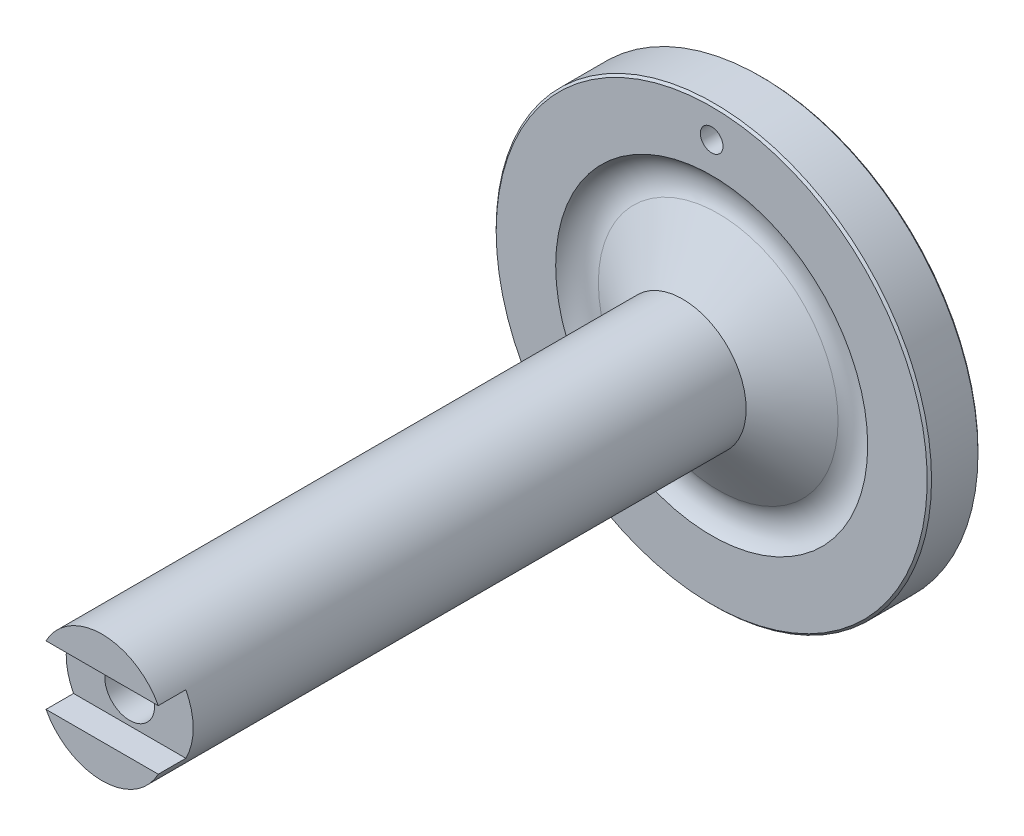
ISO-10303-21;
HEADER;
FILE_DESCRIPTION(('STEP AP214'),'2;1');
FILE_NAME('part.step','',(''),(''),'','','');
FILE_SCHEMA(('AUTOMOTIVE_DESIGN { 1 0 10303 214 1 1 1 1 }'));
ENDSEC;
DATA;
#1=APPLICATION_CONTEXT('core data for automotive mechanical design processes');
#2=APPLICATION_PROTOCOL_DEFINITION('international standard','automotive_design',2000,#1);
#3=PRODUCT_CONTEXT('',#1,'mechanical');
#4=PRODUCT('Part','Part','',(#3));
#5=PRODUCT_RELATED_PRODUCT_CATEGORY('part','',(#4));
#6=PRODUCT_DEFINITION_FORMATION('','',#4);
#7=PRODUCT_DEFINITION_CONTEXT('part definition',#1,'design');
#8=PRODUCT_DEFINITION('design','',#6,#7);
#9=PRODUCT_DEFINITION_SHAPE('','',#8);
#10=(LENGTH_UNIT() NAMED_UNIT(*) SI_UNIT(.MILLI.,.METRE.));
#11=(NAMED_UNIT(*) PLANE_ANGLE_UNIT() SI_UNIT($,.RADIAN.));
#12=(NAMED_UNIT(*) SI_UNIT($,.STERADIAN.) SOLID_ANGLE_UNIT());
#13=UNCERTAINTY_MEASURE_WITH_UNIT(LENGTH_MEASURE(1.E-05),#10,'distance_accuracy_value','');
#14=(GEOMETRIC_REPRESENTATION_CONTEXT(3) GLOBAL_UNCERTAINTY_ASSIGNED_CONTEXT((#13)) GLOBAL_UNIT_ASSIGNED_CONTEXT((#10,
#11,#12)) REPRESENTATION_CONTEXT('',''));
#15=CARTESIAN_POINT('',(0.,0.,0.));
#16=DIRECTION('',(0.,0.,1.));
#17=DIRECTION('',(1.,0.,0.));
#18=AXIS2_PLACEMENT_3D('',#15,#16,#17);
#19=CARTESIAN_POINT('',(0.,8.7376,0.));
#20=DIRECTION('',(0.,0.,-1.));
#21=DIRECTION('',(-1.,0.,0.));
#22=AXIS2_PLACEMENT_3D('',#19,#20,#21);
#23=PLANE('',#22);
#24=CARTESIAN_POINT('',(0.,0.,0.));
#25=DIRECTION('',(0.,0.,1.));
#26=DIRECTION('',(1.,0.,0.));
#27=AXIS2_PLACEMENT_3D('',#24,#25,#26);
#28=CIRCLE('',#27,22.225);
#29=CARTESIAN_POINT('',(19.6475854760833,10.3886,0.));
#30=VERTEX_POINT('',#29);
#31=CARTESIAN_POINT('',(-19.6475854760833,10.3886,0.));
#32=VERTEX_POINT('',#31);
#33=EDGE_CURVE('E161',#30,#32,#28,.T.);
#34=ORIENTED_EDGE('',*,*,#33,.T.);
#35=DIRECTION('',(1.,0.,0.));
#36=VECTOR('',#35,1.);
#37=CARTESIAN_POINT('',(-76.2,10.3886,0.));
#38=LINE('',#37,#36);
#39=EDGE_CURVE('E91',#32,#30,#38,.T.);
#40=ORIENTED_EDGE('',*,*,#39,.T.);
#41=EDGE_LOOP('',(#34,#40));
#42=FACE_BOUND('',#41,.T.);
#43=ADVANCED_FACE('F43',(#42),#23,.F.);
#44=CARTESIAN_POINT('',(0.,0.,0.));
#45=DIRECTION('',(0.,0.,1.));
#46=DIRECTION('',(1.,0.,0.));
#47=AXIS2_PLACEMENT_3D('',#44,#45,#46);
#48=CYLINDRICAL_SURFACE('',#47,22.225);
#49=ORIENTED_EDGE('',*,*,#33,.F.);
#50=DIRECTION('',(0.,0.,1.));
#51=VECTOR('',#50,1.);
#52=CARTESIAN_POINT('',(19.6475854760833,10.3886,0.));
#53=LINE('',#52,#51);
#54=CARTESIAN_POINT('',(19.6475854760833,10.3886,-9.652));
#55=VERTEX_POINT('',#54);
#56=EDGE_CURVE('E69',#30,#55,#53,.F.);
#57=ORIENTED_EDGE('',*,*,#56,.T.);
#58=CARTESIAN_POINT('',(0.,0.,-9.652));
#59=DIRECTION('',(0.,0.,-1.));
#60=DIRECTION('',(0.,1.,0.));
#61=AXIS2_PLACEMENT_3D('',#58,#59,#60);
#62=CIRCLE('',#61,22.225);
#63=CARTESIAN_POINT('',(19.6475854760833,-10.3886,-9.652));
#64=VERTEX_POINT('',#63);
#65=EDGE_CURVE('E104',#55,#64,#62,.T.);
#66=ORIENTED_EDGE('',*,*,#65,.T.);
#67=DIRECTION('',(0.,0.,1.));
#68=VECTOR('',#67,1.);
#69=CARTESIAN_POINT('',(19.6475854760833,-10.3886,0.));
#70=LINE('',#69,#68);
#71=CARTESIAN_POINT('',(19.6475854760833,-10.3886,0.));
#72=VERTEX_POINT('',#71);
#73=EDGE_CURVE('E123',#64,#72,#70,.T.);
#74=ORIENTED_EDGE('',*,*,#73,.T.);
#75=CARTESIAN_POINT('',(-19.6475854760833,-10.3886,0.));
#76=VERTEX_POINT('',#75);
#77=EDGE_CURVE('E160',#76,#72,#28,.T.);
#78=ORIENTED_EDGE('',*,*,#77,.F.);
#79=DIRECTION('',(0.,0.,1.));
#80=VECTOR('',#79,1.);
#81=CARTESIAN_POINT('',(-19.6475854760833,-10.3886,0.));
#82=LINE('',#81,#80);
#83=CARTESIAN_POINT('',(-19.6475854760833,-10.3886,-9.652));
#84=VERTEX_POINT('',#83);
#85=EDGE_CURVE('E61',#76,#84,#82,.F.);
#86=ORIENTED_EDGE('',*,*,#85,.T.);
#87=CARTESIAN_POINT('',(-19.6475854760833,10.3886,-9.652));
#88=VERTEX_POINT('',#87);
#89=EDGE_CURVE('E102',#84,#88,#62,.T.);
#90=ORIENTED_EDGE('',*,*,#89,.T.);
#91=DIRECTION('',(0.,0.,1.));
#92=VECTOR('',#91,1.);
#93=CARTESIAN_POINT('',(-19.6475854760833,10.3886,0.));
#94=LINE('',#93,#92);
#95=EDGE_CURVE('E87',#88,#32,#94,.T.);
#96=ORIENTED_EDGE('',*,*,#95,.T.);
#97=EDGE_LOOP('',(#49,#57,#66,#74,#78,#86,#90,#96));
#98=FACE_BOUND('',#97,.T.);
#99=CARTESIAN_POINT('',(0.,0.,-203.2));
#100=DIRECTION('',(0.,0.,1.));
#101=DIRECTION('',(1.,0.,0.));
#102=AXIS2_PLACEMENT_3D('',#99,#100,#101);
#103=CIRCLE('',#102,22.225);
#104=CARTESIAN_POINT('',(22.225,0.,-203.2));
#105=VERTEX_POINT('',#104);
#106=EDGE_CURVE('E97',#105,#105,#103,.T.);
#107=ORIENTED_EDGE('',*,*,#106,.T.);
#108=EDGE_LOOP('',(#107));
#109=FACE_BOUND('',#108,.T.);
#110=ADVANCED_FACE('F108',(#98,#109),#48,.T.);
#111=ORIENTED_EDGE('',*,*,#77,.T.);
#112=DIRECTION('',(1.,0.,0.));
#113=VECTOR('',#112,1.);
#114=CARTESIAN_POINT('',(-76.2,-10.3886,0.));
#115=LINE('',#114,#113);
#116=EDGE_CURVE('E119',#76,#72,#115,.T.);
#117=ORIENTED_EDGE('',*,*,#116,.F.);
#118=EDGE_LOOP('',(#111,#117));
#119=FACE_BOUND('',#118,.T.);
#120=ADVANCED_FACE('F215',(#119),#23,.F.);
#121=CARTESIAN_POINT('',(0.,0.,0.));
#122=DIRECTION('',(0.,0.,1.));
#123=DIRECTION('',(1.,0.,0.));
#124=AXIS2_PLACEMENT_3D('',#121,#122,#123);
#125=CYLINDRICAL_SURFACE('',#124,8.7376);
#126=CARTESIAN_POINT('',(0.,0.,-9.652));
#127=DIRECTION('',(0.,0.,-1.));
#128=DIRECTION('',(0.,1.,0.));
#129=AXIS2_PLACEMENT_3D('',#126,#127,#128);
#130=CIRCLE('',#129,8.7376);
#131=CARTESIAN_POINT('',(0.,8.7376,-9.652));
#132=VERTEX_POINT('',#131);
#133=EDGE_CURVE('E112',#132,#132,#130,.F.);
#134=ORIENTED_EDGE('',*,*,#133,.T.);
#135=EDGE_LOOP('',(#134));
#136=FACE_BOUND('',#135,.T.);
#137=CARTESIAN_POINT('',(0.,0.,-223.2152));
#138=DIRECTION('',(0.,0.,1.));
#139=DIRECTION('',(1.,0.,0.));
#140=AXIS2_PLACEMENT_3D('',#137,#138,#139);
#141=CIRCLE('',#140,8.7376);
#142=CARTESIAN_POINT('',(8.7376,0.,-223.2152));
#143=VERTEX_POINT('',#142);
#144=EDGE_CURVE('E156',#143,#143,#141,.T.);
#145=ORIENTED_EDGE('',*,*,#144,.F.);
#146=EDGE_LOOP('',(#145));
#147=FACE_BOUND('',#146,.T.);
#148=ADVANCED_FACE('F222',(#136,#147),#125,.F.);
#149=CARTESIAN_POINT('',(0.,15.875,-223.2152));
#150=DIRECTION('',(0.,0.,1.));
#151=DIRECTION('',(1.,0.,0.));
#152=AXIS2_PLACEMENT_3D('',#149,#150,#151);
#153=PLANE('',#152);
#154=CARTESIAN_POINT('',(0.,0.,-223.2152));
#155=DIRECTION('',(0.,0.,1.));
#156=DIRECTION('',(1.,0.,0.));
#157=AXIS2_PLACEMENT_3D('',#154,#155,#156);
#158=CIRCLE('',#157,15.875);
#159=CARTESIAN_POINT('',(15.875,0.,-223.2152));
#160=VERTEX_POINT('',#159);
#161=EDGE_CURVE('E152',#160,#160,#158,.T.);
#162=ORIENTED_EDGE('',*,*,#161,.F.);
#163=EDGE_LOOP('',(#162));
#164=FACE_BOUND('',#163,.T.);
#165=ORIENTED_EDGE('',*,*,#144,.T.);
#166=EDGE_LOOP('',(#165));
#167=FACE_BOUND('',#166,.T.);
#168=ADVANCED_FACE('F227',(#164,#167),#153,.F.);
#169=CARTESIAN_POINT('',(0.,0.,-223.2152));
#170=DIRECTION('',(0.,0.,1.));
#171=DIRECTION('',(1.,0.,0.));
#172=AXIS2_PLACEMENT_3D('',#169,#170,#171);
#173=CONICAL_SURFACE('',#172,15.875,0.785398163397456);
#174=CARTESIAN_POINT('',(0.,0.,-218.471224769071));
#175=DIRECTION('',(0.,0.,1.));
#176=DIRECTION('',(1.,0.,0.));
#177=AXIS2_PLACEMENT_3D('',#174,#175,#176);
#178=CIRCLE('',#177,20.6189752309289);
#179=CARTESIAN_POINT('',(20.6189752309289,0.,-218.471224769071));
#180=VERTEX_POINT('',#179);
#181=EDGE_CURVE('E148',#180,#180,#178,.T.);
#182=ORIENTED_EDGE('',*,*,#181,.F.);
#183=EDGE_LOOP('',(#182));
#184=FACE_BOUND('',#183,.T.);
#185=ORIENTED_EDGE('',*,*,#161,.T.);
#186=EDGE_LOOP('',(#185));
#187=FACE_BOUND('',#186,.T.);
#188=ADVANCED_FACE('F376',(#184,#187),#173,.T.);
#189=CARTESIAN_POINT('',(0.,0.,-225.206416859873));
#190=DIRECTION('',(0.,0.,1.));
#191=DIRECTION('',(1.,0.,0.));
#192=AXIS2_PLACEMENT_3D('',#189,#190,#191);
#193=TOROIDAL_SURFACE('',#192,27.3541673217308,9.52500000000001);
#194=CARTESIAN_POINT('',(0.,0.,-217.150682631207));
#195=DIRECTION('',(0.,0.,1.));
#196=DIRECTION('',(1.,0.,0.));
#197=AXIS2_PLACEMENT_3D('',#194,#195,#196);
#198=CIRCLE('',#197,32.4365654797955);
#199=CARTESIAN_POINT('',(32.4365654797955,0.,-217.150682631207));
#200=VERTEX_POINT('',#199);
#201=EDGE_CURVE('E144',#200,#200,#198,.T.);
#202=ORIENTED_EDGE('',*,*,#201,.F.);
#203=EDGE_LOOP('',(#202));
#204=FACE_BOUND('',#203,.T.);
#205=ORIENTED_EDGE('',*,*,#181,.T.);
#206=EDGE_LOOP('',(#205));
#207=FACE_BOUND('',#206,.T.);
#208=ADVANCED_FACE('F385',(#204,#207),#193,.F.);
#209=CARTESIAN_POINT('',(0.,0.,-217.150682631207));
#210=DIRECTION('',(0.,0.,-1.));
#211=DIRECTION('',(-1.,0.,0.));
#212=AXIS2_PLACEMENT_3D('',#209,#210,#211);
#213=CONICAL_SURFACE('',#212,32.4365654797955,1.00796241442012);
#214=CARTESIAN_POINT('',(0.,0.,-231.14));
#215=DIRECTION('',(0.,0.,1.));
#216=DIRECTION('',(1.,0.,0.));
#217=AXIS2_PLACEMENT_3D('',#214,#215,#216);
#218=CIRCLE('',#217,54.61);
#219=CARTESIAN_POINT('',(54.61,0.,-231.14));
#220=VERTEX_POINT('',#219);
#221=EDGE_CURVE('E140',#220,#220,#218,.T.);
#222=ORIENTED_EDGE('',*,*,#221,.F.);
#223=EDGE_LOOP('',(#222));
#224=FACE_BOUND('',#223,.T.);
#225=ORIENTED_EDGE('',*,*,#201,.T.);
#226=EDGE_LOOP('',(#225));
#227=FACE_BOUND('',#226,.T.);
#228=ADVANCED_FACE('F291',(#224,#227),#213,.F.);
#229=CARTESIAN_POINT('',(0.,76.2,-231.14));
#230=DIRECTION('',(0.,0.,1.));
#231=DIRECTION('',(1.,0.,0.));
#232=AXIS2_PLACEMENT_3D('',#229,#230,#231);
#233=PLANE('',#232);
#234=CARTESIAN_POINT('',(0.,65.405,-231.14));
#235=DIRECTION('',(0.,0.,-1.));
#236=DIRECTION('',(-1.,0.,0.));
#237=AXIS2_PLACEMENT_3D('',#234,#235,#236);
#238=CIRCLE('',#237,3.9624);
#239=CARTESIAN_POINT('',(-3.9624,65.405,-231.14));
#240=VERTEX_POINT('',#239);
#241=EDGE_CURVE('E237',#240,#240,#238,.T.);
#242=ORIENTED_EDGE('',*,*,#241,.F.);
#243=EDGE_LOOP('',(#242));
#244=FACE_BOUND('',#243,.T.);
#245=CARTESIAN_POINT('',(0.,0.,-231.14));
#246=DIRECTION('',(0.,0.,1.));
#247=DIRECTION('',(1.,0.,0.));
#248=AXIS2_PLACEMENT_3D('',#245,#246,#247);
#249=CIRCLE('',#248,75.438);
#250=CARTESIAN_POINT('',(75.438,0.,-231.14));
#251=VERTEX_POINT('',#250);
#252=EDGE_CURVE('E53',#251,#251,#249,.F.);
#253=ORIENTED_EDGE('',*,*,#252,.T.);
#254=EDGE_LOOP('',(#253));
#255=FACE_BOUND('',#254,.T.);
#256=ORIENTED_EDGE('',*,*,#221,.T.);
#257=EDGE_LOOP('',(#256));
#258=FACE_BOUND('',#257,.T.);
#259=ADVANCED_FACE('F176',(#244,#255,#258),#233,.F.);
#260=CARTESIAN_POINT('',(0.,0.,0.));
#261=DIRECTION('',(0.,0.,1.));
#262=DIRECTION('',(1.,0.,0.));
#263=AXIS2_PLACEMENT_3D('',#260,#261,#262);
#264=CYLINDRICAL_SURFACE('',#263,76.2);
#265=CARTESIAN_POINT('',(0.,0.,-230.378));
#266=DIRECTION('',(0.,0.,1.));
#267=DIRECTION('',(1.,0.,0.));
#268=AXIS2_PLACEMENT_3D('',#265,#266,#267);
#269=CIRCLE('',#268,76.2);
#270=CARTESIAN_POINT('',(76.2,0.,-230.378));
#271=VERTEX_POINT('',#270);
#272=EDGE_CURVE('E168',#271,#271,#269,.T.);
#273=ORIENTED_EDGE('',*,*,#272,.T.);
#274=EDGE_LOOP('',(#273));
#275=FACE_BOUND('',#274,.T.);
#276=CARTESIAN_POINT('',(0.,0.,-214.122));
#277=DIRECTION('',(0.,0.,-1.));
#278=DIRECTION('',(-1.,0.,0.));
#279=AXIS2_PLACEMENT_3D('',#276,#277,#278);
#280=CIRCLE('',#279,76.2);
#281=CARTESIAN_POINT('',(-76.2,0.,-214.122));
#282=VERTEX_POINT('',#281);
#283=EDGE_CURVE('E164',#282,#282,#280,.T.);
#284=ORIENTED_EDGE('',*,*,#283,.T.);
#285=EDGE_LOOP('',(#284));
#286=FACE_BOUND('',#285,.T.);
#287=ADVANCED_FACE('F185',(#275,#286),#264,.T.);
#288=CARTESIAN_POINT('',(0.,54.61,-213.36));
#289=DIRECTION('',(0.,0.,-1.));
#290=DIRECTION('',(-1.,0.,0.));
#291=AXIS2_PLACEMENT_3D('',#288,#289,#290);
#292=PLANE('',#291);
#293=CARTESIAN_POINT('',(0.,65.405,-213.36));
#294=DIRECTION('',(0.,0.,-1.));
#295=DIRECTION('',(-1.,0.,0.));
#296=AXIS2_PLACEMENT_3D('',#293,#294,#295);
#297=CIRCLE('',#296,3.9624);
#298=CARTESIAN_POINT('',(-3.9624,65.405,-213.36));
#299=VERTEX_POINT('',#298);
#300=EDGE_CURVE('E47',#299,#299,#297,.T.);
#301=ORIENTED_EDGE('',*,*,#300,.T.);
#302=EDGE_LOOP('',(#301));
#303=FACE_BOUND('',#302,.T.);
#304=CARTESIAN_POINT('',(0.,0.,-213.36));
#305=DIRECTION('',(0.,0.,-1.));
#306=DIRECTION('',(-1.,0.,0.));
#307=AXIS2_PLACEMENT_3D('',#304,#305,#306);
#308=CIRCLE('',#307,75.438);
#309=CARTESIAN_POINT('',(-75.438,0.,-213.36));
#310=VERTEX_POINT('',#309);
#311=EDGE_CURVE('E11',#310,#310,#308,.F.);
#312=ORIENTED_EDGE('',*,*,#311,.T.);
#313=EDGE_LOOP('',(#312));
#314=FACE_BOUND('',#313,.T.);
#315=CARTESIAN_POINT('',(0.,0.,-213.36));
#316=DIRECTION('',(0.,0.,1.));
#317=DIRECTION('',(1.,0.,0.));
#318=AXIS2_PLACEMENT_3D('',#315,#316,#317);
#319=CIRCLE('',#318,54.61);
#320=CARTESIAN_POINT('',(54.61,0.,-213.36));
#321=VERTEX_POINT('',#320);
#322=EDGE_CURVE('E136',#321,#321,#319,.T.);
#323=ORIENTED_EDGE('',*,*,#322,.F.);
#324=EDGE_LOOP('',(#323));
#325=FACE_BOUND('',#324,.T.);
#326=ADVANCED_FACE('F188',(#303,#314,#325),#292,.F.);
#327=CARTESIAN_POINT('',(0.,0.,-207.588870185502));
#328=DIRECTION('',(0.,0.,1.));
#329=DIRECTION('',(1.,0.,0.));
#330=AXIS2_PLACEMENT_3D('',#327,#328,#329);
#331=TOROIDAL_SURFACE('',#330,47.032422176961,9.52500000000004);
#332=CARTESIAN_POINT('',(0.,0.,-215.644604414168));
#333=DIRECTION('',(0.,0.,1.));
#334=DIRECTION('',(1.,0.,0.));
#335=AXIS2_PLACEMENT_3D('',#332,#333,#334);
#336=CIRCLE('',#335,41.9500240188962);
#337=CARTESIAN_POINT('',(41.9500240188962,0.,-215.644604414168));
#338=VERTEX_POINT('',#337);
#339=EDGE_CURVE('E132',#338,#338,#336,.T.);
#340=ORIENTED_EDGE('',*,*,#339,.F.);
#341=EDGE_LOOP('',(#340));
#342=FACE_BOUND('',#341,.T.);
#343=ORIENTED_EDGE('',*,*,#322,.T.);
#344=EDGE_LOOP('',(#343));
#345=FACE_BOUND('',#344,.T.);
#346=ADVANCED_FACE('F198',(#342,#345),#331,.F.);
#347=CARTESIAN_POINT('',(0.,0.,-215.644604414168));
#348=DIRECTION('',(0.,0.,-1.));
#349=DIRECTION('',(-1.,0.,0.));
#350=AXIS2_PLACEMENT_3D('',#347,#348,#349);
#351=CONICAL_SURFACE('',#350,41.9500240188962,1.00796241442012);
#352=ORIENTED_EDGE('',*,*,#106,.F.);
#353=EDGE_LOOP('',(#352));
#354=FACE_BOUND('',#353,.T.);
#355=ORIENTED_EDGE('',*,*,#339,.T.);
#356=EDGE_LOOP('',(#355));
#357=FACE_BOUND('',#356,.T.);
#358=ADVANCED_FACE('F182',(#354,#357),#351,.T.);
#359=CARTESIAN_POINT('',(0.,0.,-230.378));
#360=DIRECTION('',(0.,0.,1.));
#361=DIRECTION('',(1.,0.,0.));
#362=AXIS2_PLACEMENT_3D('',#359,#360,#361);
#363=CONICAL_SURFACE('',#362,76.2,0.785398163397448);
#364=CARTESIAN_POINT('',(75.438,0.,-231.14));
#365=CARTESIAN_POINT('',(75.4459375,0.,-231.1320625));
#366=CARTESIAN_POINT('',(75.453875,0.,-231.124125));
#367=CARTESIAN_POINT('',(75.46975,0.,-231.10825));
#368=CARTESIAN_POINT('',(75.4776875,0.,-231.1003125));
#369=CARTESIAN_POINT('',(75.4935625,0.,-231.0844375));
#370=CARTESIAN_POINT('',(75.5015,0.,-231.0765));
#371=CARTESIAN_POINT('',(75.517375,0.,-231.060625));
#372=CARTESIAN_POINT('',(75.5253125,0.,-231.0526875));
#373=CARTESIAN_POINT('',(75.5411875,0.,-231.0368125));
#374=CARTESIAN_POINT('',(75.549125,0.,-231.028875));
#375=CARTESIAN_POINT('',(75.565,0.,-231.013));
#376=CARTESIAN_POINT('',(75.5729375,0.,-231.0050625));
#377=CARTESIAN_POINT('',(75.5888125,0.,-230.9891875));
#378=CARTESIAN_POINT('',(75.59675,0.,-230.98125));
#379=CARTESIAN_POINT('',(75.612625,0.,-230.965375));
#380=CARTESIAN_POINT('',(75.6205625,0.,-230.9574375));
#381=CARTESIAN_POINT('',(75.6364375,0.,-230.9415625));
#382=CARTESIAN_POINT('',(75.644375,0.,-230.933625));
#383=CARTESIAN_POINT('',(75.66025,0.,-230.91775));
#384=CARTESIAN_POINT('',(75.6681875,0.,-230.9098125));
#385=CARTESIAN_POINT('',(75.6840625,0.,-230.8939375));
#386=CARTESIAN_POINT('',(75.692,0.,-230.886));
#387=CARTESIAN_POINT('',(75.707875,0.,-230.870125));
#388=CARTESIAN_POINT('',(75.7158125,0.,-230.8621875));
#389=CARTESIAN_POINT('',(75.7316875,0.,-230.8463125));
#390=CARTESIAN_POINT('',(75.739625,0.,-230.838375));
#391=CARTESIAN_POINT('',(75.7555,0.,-230.8225));
#392=CARTESIAN_POINT('',(75.7634375,0.,-230.8145625));
#393=CARTESIAN_POINT('',(75.7793125,0.,-230.7986875));
#394=CARTESIAN_POINT('',(75.78725,0.,-230.79075));
#395=CARTESIAN_POINT('',(75.803125,0.,-230.774875));
#396=CARTESIAN_POINT('',(75.8110625,0.,-230.7669375));
#397=CARTESIAN_POINT('',(75.8269375,0.,-230.7510625));
#398=CARTESIAN_POINT('',(75.834875,0.,-230.743125));
#399=CARTESIAN_POINT('',(75.85075,0.,-230.72725));
#400=CARTESIAN_POINT('',(75.8586875,0.,-230.7193125));
#401=CARTESIAN_POINT('',(75.8745625,0.,-230.7034375));
#402=CARTESIAN_POINT('',(75.8825,0.,-230.6955));
#403=CARTESIAN_POINT('',(75.898375,0.,-230.679625));
#404=CARTESIAN_POINT('',(75.9063125,0.,-230.6716875));
#405=CARTESIAN_POINT('',(75.9221875,0.,-230.6558125));
#406=CARTESIAN_POINT('',(75.930125,0.,-230.647875));
#407=CARTESIAN_POINT('',(75.946,0.,-230.632));
#408=CARTESIAN_POINT('',(75.9539375,0.,-230.6240625));
#409=CARTESIAN_POINT('',(75.9698125,0.,-230.6081875));
#410=CARTESIAN_POINT('',(75.97775,0.,-230.60025));
#411=CARTESIAN_POINT('',(75.993625,0.,-230.584375));
#412=CARTESIAN_POINT('',(76.0015625,0.,-230.5764375));
#413=CARTESIAN_POINT('',(76.0174375,0.,-230.5605625));
#414=CARTESIAN_POINT('',(76.025375,0.,-230.552625));
#415=CARTESIAN_POINT('',(76.04125,0.,-230.53675));
#416=CARTESIAN_POINT('',(76.0491875,0.,-230.5288125));
#417=CARTESIAN_POINT('',(76.0650625,0.,-230.5129375));
#418=CARTESIAN_POINT('',(76.073,0.,-230.505));
#419=CARTESIAN_POINT('',(76.088875,0.,-230.489125));
#420=CARTESIAN_POINT('',(76.0968125,0.,-230.4811875));
#421=CARTESIAN_POINT('',(76.1126875,0.,-230.4653125));
#422=CARTESIAN_POINT('',(76.120625,0.,-230.457375));
#423=CARTESIAN_POINT('',(76.1365,0.,-230.4415));
#424=CARTESIAN_POINT('',(76.1444375,0.,-230.4335625));
#425=CARTESIAN_POINT('',(76.1603125,0.,-230.4176875));
#426=CARTESIAN_POINT('',(76.16825,0.,-230.40975));
#427=CARTESIAN_POINT('',(76.184125,0.,-230.393875));
#428=CARTESIAN_POINT('',(76.1920625,0.,-230.3859375));
#429=CARTESIAN_POINT('',(76.2,0.,-230.378));
#430=B_SPLINE_CURVE_WITH_KNOTS('',3,(#364,#365,#366,#367,#368,#369,#370,#371,#372,#373,#374,
#375,#376,#377,#378,#379,#380,#381,#382,#383,#384,#385,#386,#387,#388,#389,#390,#391,#392,#393,
#394,#395,#396,#397,#398,#399,#400,#401,#402,#403,#404,#405,#406,#407,#408,#409,#410,#411,#412,
#413,#414,#415,#416,#417,#418,#419,#420,#421,#422,#423,#424,#425,#426,#427,#428,#429),
.UNSPECIFIED.,.F.,.F.,(4,2,2,2,2,2,2,2,2,2,2,2,2,2,2,2,2,2,2,2,2,2,2,2,2,2,2,2,2,2,2,2,4),(0.,
0.0336759604540062,0.0673519209080124,0.101027881362028,0.134703841816035,0.168379802270041,
0.202055762724047,0.235731723178053,0.269407683632059,0.303083644086075,0.336759604540082,
0.370435564994107,0.404111525448114,0.43778748590212,0.471463446356136,0.505139406810142,
0.538815367264148,0.572491327718154,0.606167288172161,0.639843248626177,0.673519209080183,
0.707195169534189,0.740871129988215,0.774547090442221,0.808223050896237,0.841899011350243,
0.87557497180425,0.909250932258256,0.942926892712262,0.976602853166268,1.01027881362028,
1.04395477407429,1.07763073452832),.UNSPECIFIED.);
#431=EDGE_CURVE('BSEAM179',#251,#271,#430,.T.);
#432=ORIENTED_EDGE('',*,*,#252,.F.);
#433=ORIENTED_EDGE('',*,*,#272,.F.);
#434=ORIENTED_EDGE('',*,*,#431,.T.);
#435=ORIENTED_EDGE('',*,*,#431,.F.);
#436=EDGE_LOOP('',(#432,#434,#433,#435));
#437=FACE_BOUND('',#436,.T.);
#438=ADVANCED_FACE('F179',(#437),#363,.T.);
#439=CARTESIAN_POINT('',(0.,0.,-213.36));
#440=DIRECTION('',(0.,0.,-1.));
#441=DIRECTION('',(-1.,0.,0.));
#442=AXIS2_PLACEMENT_3D('',#439,#440,#441);
#443=CONICAL_SURFACE('',#442,75.438,0.78539816339743);
#444=ORIENTED_EDGE('',*,*,#283,.F.);
#445=EDGE_LOOP('',(#444));
#446=FACE_BOUND('',#445,.T.);
#447=ORIENTED_EDGE('',*,*,#311,.F.);
#448=EDGE_LOOP('',(#447));
#449=FACE_BOUND('',#448,.T.);
#450=ADVANCED_FACE('F45',(#446,#449),#443,.T.);
#451=CARTESIAN_POINT('',(-76.2,10.3886,-9.652));
#452=DIRECTION('',(0.,1.,0.));
#453=DIRECTION('',(0.,0.,1.));
#454=AXIS2_PLACEMENT_3D('',#451,#452,#453);
#455=PLANE('',#454);
#456=DIRECTION('',(1.,0.,0.));
#457=VECTOR('',#456,1.);
#458=CARTESIAN_POINT('',(-76.2,10.3886,-9.652));
#459=LINE('',#458,#457);
#460=EDGE_CURVE('E90',#88,#55,#459,.T.);
#461=ORIENTED_EDGE('',*,*,#460,.T.);
#462=ORIENTED_EDGE('',*,*,#56,.F.);
#463=ORIENTED_EDGE('',*,*,#39,.F.);
#464=ORIENTED_EDGE('',*,*,#95,.F.);
#465=EDGE_LOOP('',(#461,#462,#463,#464));
#466=FACE_BOUND('',#465,.T.);
#467=ADVANCED_FACE('F89',(#466),#455,.F.);
#468=CARTESIAN_POINT('',(-76.2,-10.3886,-9.652));
#469=DIRECTION('',(0.,-1.,0.));
#470=DIRECTION('',(0.,0.,-1.));
#471=AXIS2_PLACEMENT_3D('',#468,#469,#470);
#472=PLANE('',#471);
#473=DIRECTION('',(1.,0.,0.));
#474=VECTOR('',#473,1.);
#475=CARTESIAN_POINT('',(-76.2,-10.3886,-9.652));
#476=LINE('',#475,#474);
#477=EDGE_CURVE('E106',#84,#64,#476,.T.);
#478=ORIENTED_EDGE('',*,*,#477,.F.);
#479=ORIENTED_EDGE('',*,*,#85,.F.);
#480=ORIENTED_EDGE('',*,*,#116,.T.);
#481=ORIENTED_EDGE('',*,*,#73,.F.);
#482=EDGE_LOOP('',(#478,#479,#480,#481));
#483=FACE_BOUND('',#482,.T.);
#484=ADVANCED_FACE('F231',(#483),#472,.F.);
#485=CARTESIAN_POINT('',(-76.2,-10.3886,-9.652));
#486=DIRECTION('',(0.,0.,-1.));
#487=DIRECTION('',(0.,1.,0.));
#488=AXIS2_PLACEMENT_3D('',#485,#486,#487);
#489=PLANE('',#488);
#490=ORIENTED_EDGE('',*,*,#133,.F.);
#491=EDGE_LOOP('',(#490));
#492=FACE_BOUND('',#491,.T.);
#493=ORIENTED_EDGE('',*,*,#460,.F.);
#494=ORIENTED_EDGE('',*,*,#89,.F.);
#495=ORIENTED_EDGE('',*,*,#477,.T.);
#496=ORIENTED_EDGE('',*,*,#65,.F.);
#497=EDGE_LOOP('',(#493,#494,#495,#496));
#498=FACE_BOUND('',#497,.T.);
#499=ADVANCED_FACE('F100',(#492,#498),#489,.F.);
#500=CARTESIAN_POINT('',(0.,65.405,0.));
#501=DIRECTION('',(0.,0.,-1.));
#502=DIRECTION('',(-1.,0.,0.));
#503=AXIS2_PLACEMENT_3D('',#500,#501,#502);
#504=CYLINDRICAL_SURFACE('',#503,3.9624);
#505=ORIENTED_EDGE('',*,*,#241,.T.);
#506=EDGE_LOOP('',(#505));
#507=FACE_BOUND('',#506,.T.);
#508=ORIENTED_EDGE('',*,*,#300,.F.);
#509=EDGE_LOOP('',(#508));
#510=FACE_BOUND('',#509,.T.);
#511=ADVANCED_FACE('F246',(#507,#510),#504,.F.);
#512=CLOSED_SHELL('',(#43,#110,#120,#148,#168,#188,#208,#228,#259,#287,#326,#346,#358,#438,#450,
#467,#484,#499,#511));
#513=MANIFOLD_SOLID_BREP('B2',#512);
#514=ADVANCED_BREP_SHAPE_REPRESENTATION('',(#18,#513),#14);
#515=SHAPE_DEFINITION_REPRESENTATION(#9,#514);
ENDSEC;
END-ISO-10303-21;
